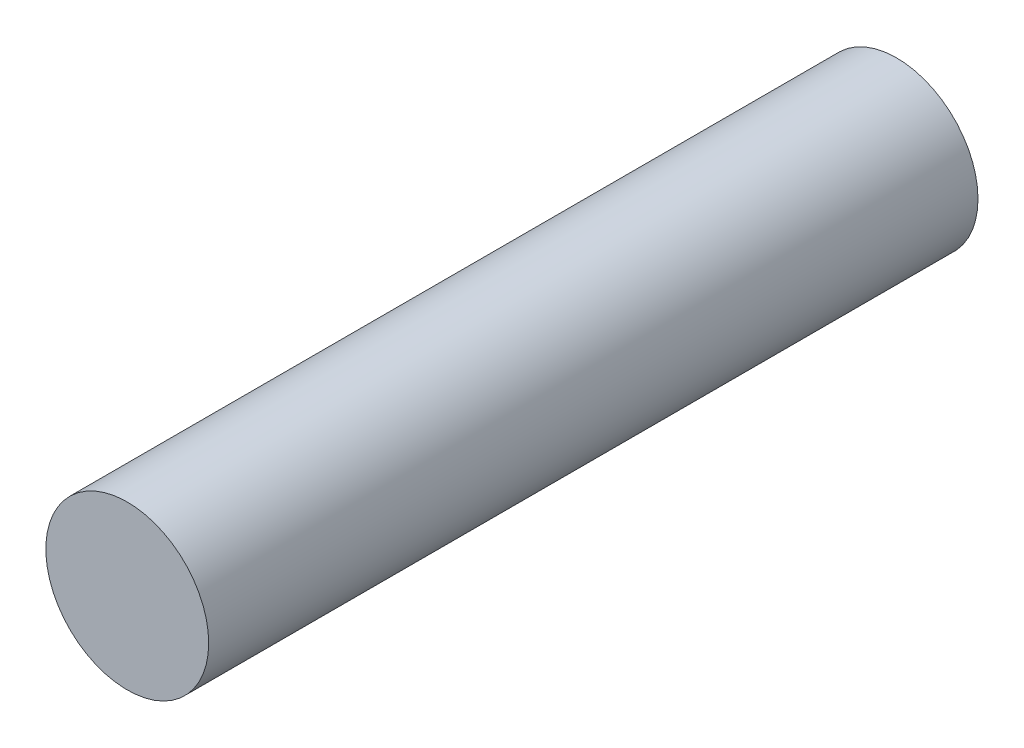
ISO-10303-21;
HEADER;
FILE_DESCRIPTION(('STEP AP214'),'2;1');
FILE_NAME('part.step','',(''),(''),'','','');
FILE_SCHEMA(('AUTOMOTIVE_DESIGN { 1 0 10303 214 1 1 1 1 }'));
ENDSEC;
DATA;
#1=APPLICATION_CONTEXT('core data for automotive mechanical design processes');
#2=APPLICATION_PROTOCOL_DEFINITION('international standard','automotive_design',2000,#1);
#3=PRODUCT_CONTEXT('',#1,'mechanical');
#4=PRODUCT('Part','Part','',(#3));
#5=PRODUCT_RELATED_PRODUCT_CATEGORY('part','',(#4));
#6=PRODUCT_DEFINITION_FORMATION('','',#4);
#7=PRODUCT_DEFINITION_CONTEXT('part definition',#1,'design');
#8=PRODUCT_DEFINITION('design','',#6,#7);
#9=PRODUCT_DEFINITION_SHAPE('','',#8);
#10=(LENGTH_UNIT() NAMED_UNIT(*) SI_UNIT(.MILLI.,.METRE.));
#11=(NAMED_UNIT(*) PLANE_ANGLE_UNIT() SI_UNIT($,.RADIAN.));
#12=(NAMED_UNIT(*) SI_UNIT($,.STERADIAN.) SOLID_ANGLE_UNIT());
#13=UNCERTAINTY_MEASURE_WITH_UNIT(LENGTH_MEASURE(1.E-05),#10,'distance_accuracy_value','');
#14=(GEOMETRIC_REPRESENTATION_CONTEXT(3) GLOBAL_UNCERTAINTY_ASSIGNED_CONTEXT((#13)) GLOBAL_UNIT_ASSIGNED_CONTEXT((#10,
#11,#12)) REPRESENTATION_CONTEXT('',''));
#15=CARTESIAN_POINT('',(0.,0.,0.));
#16=DIRECTION('',(0.,0.,1.));
#17=DIRECTION('',(1.,0.,0.));
#18=AXIS2_PLACEMENT_3D('',#15,#16,#17);
#19=CARTESIAN_POINT('',(0.,0.,30.));
#20=DIRECTION('',(0.,0.,-1.));
#21=DIRECTION('',(-1.,0.,0.));
#22=AXIS2_PLACEMENT_3D('',#19,#20,#21);
#23=CYLINDRICAL_SURFACE('',#22,3.175);
#24=CARTESIAN_POINT('',(0.,0.,30.));
#25=DIRECTION('',(0.,0.,1.));
#26=DIRECTION('',(1.,0.,0.));
#27=AXIS2_PLACEMENT_3D('',#24,#25,#26);
#28=CIRCLE('',#27,3.175);
#29=CARTESIAN_POINT('',(3.175,0.,30.));
#30=VERTEX_POINT('',#29);
#31=EDGE_CURVE('E10',#30,#30,#28,.T.);
#32=ORIENTED_EDGE('',*,*,#31,.F.);
#33=EDGE_LOOP('',(#32));
#34=FACE_BOUND('',#33,.T.);
#35=CARTESIAN_POINT('',(0.,0.,0.));
#36=DIRECTION('',(0.,0.,1.));
#37=DIRECTION('',(1.,0.,0.));
#38=AXIS2_PLACEMENT_3D('',#35,#36,#37);
#39=CIRCLE('',#38,3.175);
#40=CARTESIAN_POINT('',(3.175,0.,0.));
#41=VERTEX_POINT('',#40);
#42=EDGE_CURVE('E46',#41,#41,#39,.T.);
#43=ORIENTED_EDGE('',*,*,#42,.T.);
#44=EDGE_LOOP('',(#43));
#45=FACE_BOUND('',#44,.T.);
#46=ADVANCED_FACE('F43',(#34,#45),#23,.T.);
#47=CARTESIAN_POINT('',(0.,0.,30.));
#48=DIRECTION('',(0.,0.,1.));
#49=DIRECTION('',(1.,0.,0.));
#50=AXIS2_PLACEMENT_3D('',#47,#48,#49);
#51=PLANE('',#50);
#52=ORIENTED_EDGE('',*,*,#31,.T.);
#53=EDGE_LOOP('',(#52));
#54=FACE_BOUND('',#53,.T.);
#55=ADVANCED_FACE('F60',(#54),#51,.T.);
#56=CARTESIAN_POINT('',(0.,0.,0.));
#57=DIRECTION('',(0.,0.,1.));
#58=DIRECTION('',(1.,0.,0.));
#59=AXIS2_PLACEMENT_3D('',#56,#57,#58);
#60=PLANE('',#59);
#61=ORIENTED_EDGE('',*,*,#42,.F.);
#62=EDGE_LOOP('',(#61));
#63=FACE_BOUND('',#62,.T.);
#64=ADVANCED_FACE('F58',(#63),#60,.F.);
#65=CLOSED_SHELL('',(#46,#55,#64));
#66=MANIFOLD_SOLID_BREP('B2',#65);
#67=ADVANCED_BREP_SHAPE_REPRESENTATION('',(#18,#66),#14);
#68=SHAPE_DEFINITION_REPRESENTATION(#9,#67);
ENDSEC;
END-ISO-10303-21;
